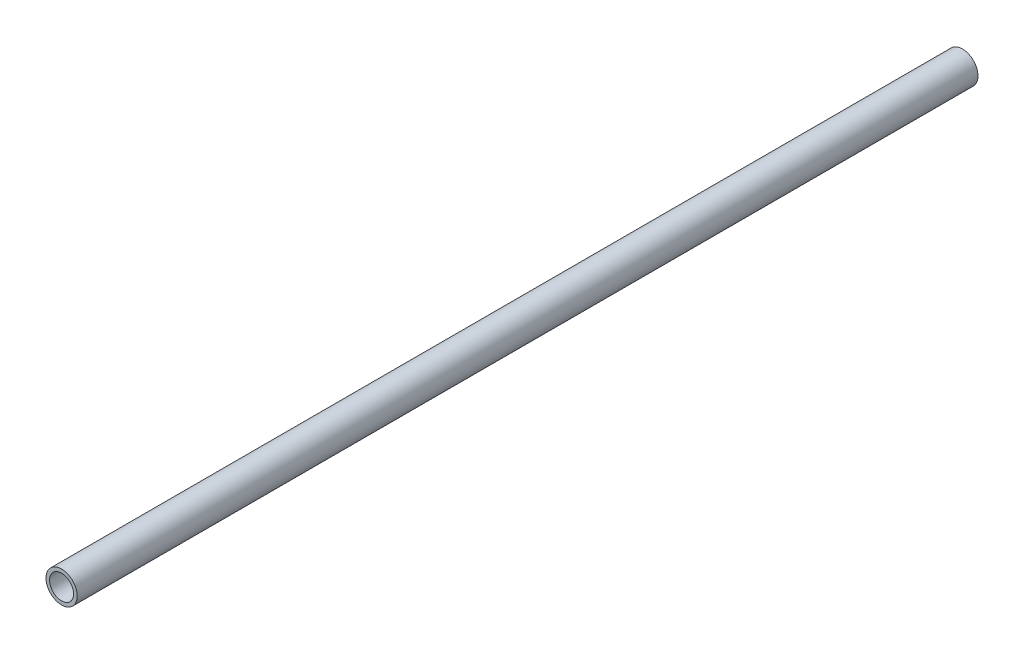
ISO-10303-21;
HEADER;
FILE_DESCRIPTION(('STEP AP214'),'2;1');
FILE_NAME('part.step','',(''),(''),'','','');
FILE_SCHEMA(('AUTOMOTIVE_DESIGN { 1 0 10303 214 1 1 1 1 }'));
ENDSEC;
DATA;
#1=APPLICATION_CONTEXT('core data for automotive mechanical design processes');
#2=APPLICATION_PROTOCOL_DEFINITION('international standard','automotive_design',2000,#1);
#3=PRODUCT_CONTEXT('',#1,'mechanical');
#4=PRODUCT('Part','Part','',(#3));
#5=PRODUCT_RELATED_PRODUCT_CATEGORY('part','',(#4));
#6=PRODUCT_DEFINITION_FORMATION('','',#4);
#7=PRODUCT_DEFINITION_CONTEXT('part definition',#1,'design');
#8=PRODUCT_DEFINITION('design','',#6,#7);
#9=PRODUCT_DEFINITION_SHAPE('','',#8);
#10=(LENGTH_UNIT() NAMED_UNIT(*) SI_UNIT(.MILLI.,.METRE.));
#11=(NAMED_UNIT(*) PLANE_ANGLE_UNIT() SI_UNIT($,.RADIAN.));
#12=(NAMED_UNIT(*) SI_UNIT($,.STERADIAN.) SOLID_ANGLE_UNIT());
#13=UNCERTAINTY_MEASURE_WITH_UNIT(LENGTH_MEASURE(1.E-05),#10,'distance_accuracy_value','');
#14=(GEOMETRIC_REPRESENTATION_CONTEXT(3) GLOBAL_UNCERTAINTY_ASSIGNED_CONTEXT((#13)) GLOBAL_UNIT_ASSIGNED_CONTEXT((#10,
#11,#12)) REPRESENTATION_CONTEXT('',''));
#15=CARTESIAN_POINT('',(0.,0.,0.));
#16=DIRECTION('',(0.,0.,1.));
#17=DIRECTION('',(1.,0.,0.));
#18=AXIS2_PLACEMENT_3D('',#15,#16,#17);
#19=CARTESIAN_POINT('',(0.,0.,952.5));
#20=DIRECTION('',(0.,0.,1.));
#21=DIRECTION('',(1.,0.,0.));
#22=AXIS2_PLACEMENT_3D('',#19,#20,#21);
#23=PLANE('',#22);
#24=CARTESIAN_POINT('',(0.,0.,952.5));
#25=DIRECTION('',(0.,0.,1.));
#26=DIRECTION('',(1.,0.,0.));
#27=AXIS2_PLACEMENT_3D('',#24,#25,#26);
#28=CIRCLE('',#27,16.51);
#29=CARTESIAN_POINT('',(16.51,0.,952.5));
#30=VERTEX_POINT('',#29);
#31=EDGE_CURVE('E10',#30,#30,#28,.T.);
#32=ORIENTED_EDGE('',*,*,#31,.T.);
#33=EDGE_LOOP('',(#32));
#34=FACE_BOUND('',#33,.T.);
#35=CARTESIAN_POINT('',(0.,0.,952.5));
#36=DIRECTION('',(0.,0.,1.));
#37=DIRECTION('',(1.,0.,0.));
#38=AXIS2_PLACEMENT_3D('',#35,#36,#37);
#39=CIRCLE('',#38,12.7);
#40=CARTESIAN_POINT('',(12.7,0.,952.5));
#41=VERTEX_POINT('',#40);
#42=EDGE_CURVE('E45',#41,#41,#39,.T.);
#43=ORIENTED_EDGE('',*,*,#42,.F.);
#44=EDGE_LOOP('',(#43));
#45=FACE_BOUND('',#44,.T.);
#46=ADVANCED_FACE('F34',(#34,#45),#23,.T.);
#47=CARTESIAN_POINT('',(0.,0.,0.));
#48=DIRECTION('',(0.,0.,1.));
#49=DIRECTION('',(1.,0.,0.));
#50=AXIS2_PLACEMENT_3D('',#47,#48,#49);
#51=PLANE('',#50);
#52=CARTESIAN_POINT('',(0.,0.,0.));
#53=DIRECTION('',(0.,0.,1.));
#54=DIRECTION('',(1.,0.,0.));
#55=AXIS2_PLACEMENT_3D('',#52,#53,#54);
#56=CIRCLE('',#55,16.51);
#57=CARTESIAN_POINT('',(16.51,0.,0.));
#58=VERTEX_POINT('',#57);
#59=EDGE_CURVE('E38',#58,#58,#56,.T.);
#60=ORIENTED_EDGE('',*,*,#59,.F.);
#61=EDGE_LOOP('',(#60));
#62=FACE_BOUND('',#61,.T.);
#63=CARTESIAN_POINT('',(0.,0.,0.));
#64=DIRECTION('',(0.,0.,1.));
#65=DIRECTION('',(1.,0.,0.));
#66=AXIS2_PLACEMENT_3D('',#63,#64,#65);
#67=CIRCLE('',#66,12.7);
#68=CARTESIAN_POINT('',(12.7,0.,0.));
#69=VERTEX_POINT('',#68);
#70=EDGE_CURVE('E47',#69,#69,#67,.T.);
#71=ORIENTED_EDGE('',*,*,#70,.T.);
#72=EDGE_LOOP('',(#71));
#73=FACE_BOUND('',#72,.T.);
#74=ADVANCED_FACE('F57',(#62,#73),#51,.F.);
#75=CARTESIAN_POINT('',(0.,0.,952.5));
#76=DIRECTION('',(0.,0.,-1.));
#77=DIRECTION('',(-1.,0.,0.));
#78=AXIS2_PLACEMENT_3D('',#75,#76,#77);
#79=CYLINDRICAL_SURFACE('',#78,16.51);
#80=ORIENTED_EDGE('',*,*,#31,.F.);
#81=EDGE_LOOP('',(#80));
#82=FACE_BOUND('',#81,.T.);
#83=ORIENTED_EDGE('',*,*,#59,.T.);
#84=EDGE_LOOP('',(#83));
#85=FACE_BOUND('',#84,.T.);
#86=ADVANCED_FACE('F36',(#82,#85),#79,.T.);
#87=CARTESIAN_POINT('',(0.,0.,952.5));
#88=DIRECTION('',(0.,0.,-1.));
#89=DIRECTION('',(-1.,0.,0.));
#90=AXIS2_PLACEMENT_3D('',#87,#88,#89);
#91=CYLINDRICAL_SURFACE('',#90,12.7);
#92=ORIENTED_EDGE('',*,*,#42,.T.);
#93=EDGE_LOOP('',(#92));
#94=FACE_BOUND('',#93,.T.);
#95=ORIENTED_EDGE('',*,*,#70,.F.);
#96=EDGE_LOOP('',(#95));
#97=FACE_BOUND('',#96,.T.);
#98=ADVANCED_FACE('F53',(#94,#97),#91,.F.);
#99=CLOSED_SHELL('',(#46,#74,#86,#98));
#100=MANIFOLD_SOLID_BREP('B2',#99);
#101=ADVANCED_BREP_SHAPE_REPRESENTATION('',(#18,#100),#14);
#102=SHAPE_DEFINITION_REPRESENTATION(#9,#101);
ENDSEC;
END-ISO-10303-21;
